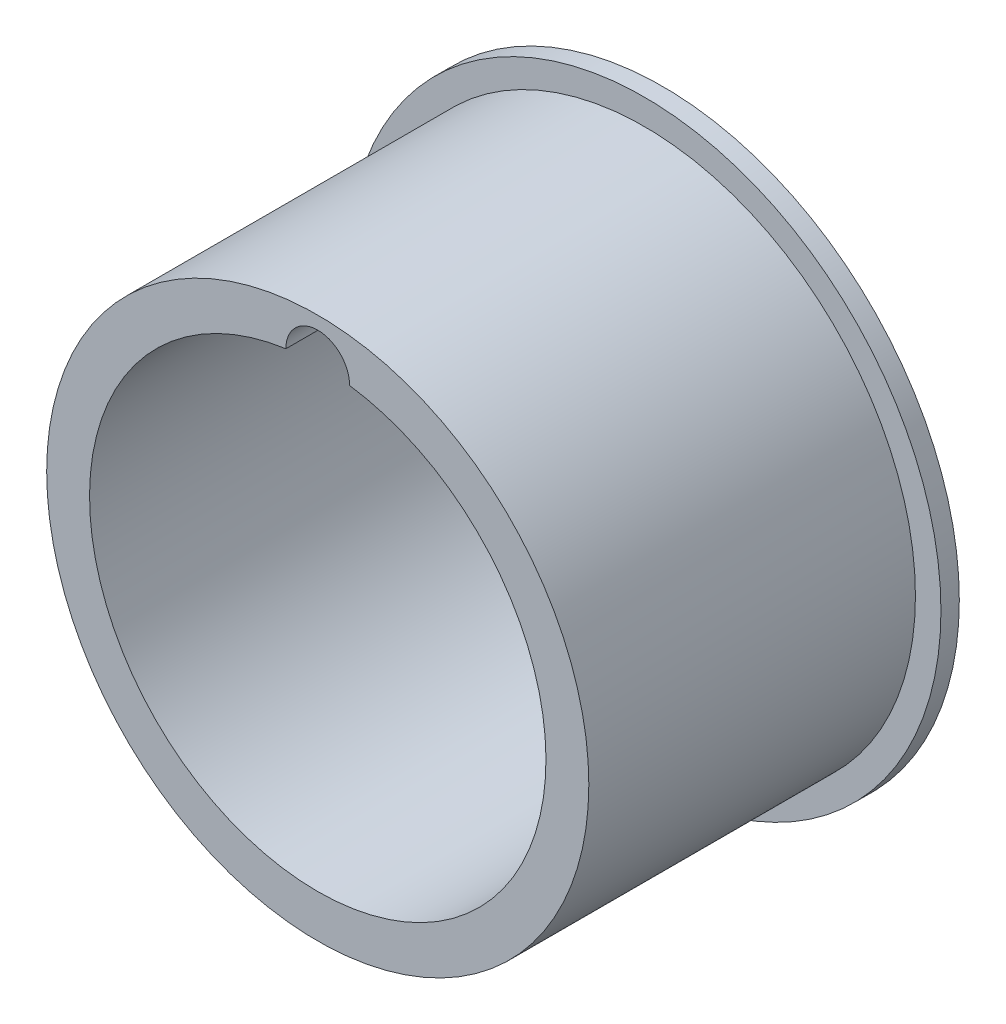
ISO-10303-21;
HEADER;
FILE_DESCRIPTION(('STEP AP214'),'2;1');
FILE_NAME('part.step','',(''),(''),'','','');
FILE_SCHEMA(('AUTOMOTIVE_DESIGN { 1 0 10303 214 1 1 1 1 }'));
ENDSEC;
DATA;
#1=APPLICATION_CONTEXT('core data for automotive mechanical design processes');
#2=APPLICATION_PROTOCOL_DEFINITION('international standard','automotive_design',2000,#1);
#3=PRODUCT_CONTEXT('',#1,'mechanical');
#4=PRODUCT('Part','Part','',(#3));
#5=PRODUCT_RELATED_PRODUCT_CATEGORY('part','',(#4));
#6=PRODUCT_DEFINITION_FORMATION('','',#4);
#7=PRODUCT_DEFINITION_CONTEXT('part definition',#1,'design');
#8=PRODUCT_DEFINITION('design','',#6,#7);
#9=PRODUCT_DEFINITION_SHAPE('','',#8);
#10=(LENGTH_UNIT() NAMED_UNIT(*) SI_UNIT(.MILLI.,.METRE.));
#11=(NAMED_UNIT(*) PLANE_ANGLE_UNIT() SI_UNIT($,.RADIAN.));
#12=(NAMED_UNIT(*) SI_UNIT($,.STERADIAN.) SOLID_ANGLE_UNIT());
#13=UNCERTAINTY_MEASURE_WITH_UNIT(LENGTH_MEASURE(1.E-05),#10,'distance_accuracy_value','');
#14=(GEOMETRIC_REPRESENTATION_CONTEXT(3) GLOBAL_UNCERTAINTY_ASSIGNED_CONTEXT((#13)) GLOBAL_UNIT_ASSIGNED_CONTEXT((#10,
#11,#12)) REPRESENTATION_CONTEXT('',''));
#15=CARTESIAN_POINT('',(0.,0.,0.));
#16=DIRECTION('',(0.,0.,1.));
#17=DIRECTION('',(1.,0.,0.));
#18=AXIS2_PLACEMENT_3D('',#15,#16,#17);
#19=CARTESIAN_POINT('',(0.,0.,0.));
#20=DIRECTION('',(0.,0.,1.));
#21=DIRECTION('',(1.,0.,0.));
#22=AXIS2_PLACEMENT_3D('',#19,#20,#21);
#23=PLANE('',#22);
#24=CARTESIAN_POINT('',(0.,28.1444585537394,0.));
#25=DIRECTION('',(0.,0.,1.));
#26=DIRECTION('',(1.,0.,0.));
#27=AXIS2_PLACEMENT_3D('',#24,#25,#26);
#28=CIRCLE('',#27,3.96252340873946);
#29=CARTESIAN_POINT('',(-3.96244410089683,28.1193884106192,0.));
#30=VERTEX_POINT('',#29);
#31=CARTESIAN_POINT('',(-3.95269283666769,27.8655121363687,0.));
#32=VERTEX_POINT('',#31);
#33=EDGE_CURVE('E130',#30,#32,#28,.T.);
#34=ORIENTED_EDGE('',*,*,#33,.F.);
#35=CARTESIAN_POINT('',(0.,0.,0.));
#36=DIRECTION('',(0.,0.,1.));
#37=DIRECTION('',(1.,0.,0.));
#38=AXIS2_PLACEMENT_3D('',#35,#36,#37);
#39=CIRCLE('',#38,28.3972);
#40=CARTESIAN_POINT('',(3.96244410089684,28.1193884106192,0.));
#41=VERTEX_POINT('',#40);
#42=EDGE_CURVE('E88',#41,#30,#39,.F.);
#43=ORIENTED_EDGE('',*,*,#42,.F.);
#44=CARTESIAN_POINT('',(3.95269283666769,27.8655121363687,0.));
#45=VERTEX_POINT('',#44);
#46=EDGE_CURVE('E90',#45,#41,#28,.T.);
#47=ORIENTED_EDGE('',*,*,#46,.F.);
#48=CARTESIAN_POINT('',(0.,0.,0.));
#49=DIRECTION('',(0.,0.,1.));
#50=DIRECTION('',(1.,0.,0.));
#51=AXIS2_PLACEMENT_3D('',#48,#49,#50);
#52=CIRCLE('',#51,28.1444585537394);
#53=EDGE_CURVE('E114',#32,#45,#52,.T.);
#54=ORIENTED_EDGE('',*,*,#53,.F.);
#55=EDGE_LOOP('',(#34,#43,#47,#54));
#56=FACE_BOUND('',#55,.T.);
#57=ADVANCED_FACE('F39',(#56),#23,.T.);
#58=CARTESIAN_POINT('',(0.,0.,-2.286));
#59=DIRECTION('',(0.,0.,1.));
#60=DIRECTION('',(1.,0.,0.));
#61=AXIS2_PLACEMENT_3D('',#58,#59,#60);
#62=CYLINDRICAL_SURFACE('',#61,36.9062);
#63=CARTESIAN_POINT('',(0.,0.,-2.286));
#64=DIRECTION('',(0.,0.,1.));
#65=DIRECTION('',(1.,0.,0.));
#66=AXIS2_PLACEMENT_3D('',#63,#64,#65);
#67=CIRCLE('',#66,36.9062);
#68=CARTESIAN_POINT('',(36.9062,0.,-2.286));
#69=VERTEX_POINT('',#68);
#70=EDGE_CURVE('E101',#69,#69,#67,.T.);
#71=ORIENTED_EDGE('',*,*,#70,.T.);
#72=EDGE_LOOP('',(#71));
#73=FACE_BOUND('',#72,.T.);
#74=CARTESIAN_POINT('',(0.,0.,0.));
#75=DIRECTION('',(0.,0.,1.));
#76=DIRECTION('',(1.,0.,0.));
#77=AXIS2_PLACEMENT_3D('',#74,#75,#76);
#78=CIRCLE('',#77,36.9062);
#79=CARTESIAN_POINT('',(36.9062,0.,0.));
#80=VERTEX_POINT('',#79);
#81=EDGE_CURVE('E106',#80,#80,#78,.T.);
#82=ORIENTED_EDGE('',*,*,#81,.F.);
#83=EDGE_LOOP('',(#82));
#84=FACE_BOUND('',#83,.T.);
#85=ADVANCED_FACE('F146',(#73,#84),#62,.T.);
#86=CARTESIAN_POINT('',(0.,0.,-2.286));
#87=DIRECTION('',(0.,0.,1.));
#88=DIRECTION('',(1.,0.,0.));
#89=AXIS2_PLACEMENT_3D('',#86,#87,#88);
#90=PLANE('',#89);
#91=CARTESIAN_POINT('',(0.,0.,-2.286));
#92=DIRECTION('',(0.,0.,1.));
#93=DIRECTION('',(1.,0.,0.));
#94=AXIS2_PLACEMENT_3D('',#91,#92,#93);
#95=CIRCLE('',#94,28.1444585537394);
#96=CARTESIAN_POINT('',(-3.95269283666771,27.8655121363687,-2.286));
#97=VERTEX_POINT('',#96);
#98=CARTESIAN_POINT('',(3.95269283666771,27.8655121363687,-2.286));
#99=VERTEX_POINT('',#98);
#100=EDGE_CURVE('E110',#97,#99,#95,.T.);
#101=ORIENTED_EDGE('',*,*,#100,.T.);
#102=CARTESIAN_POINT('',(0.,28.1444585537394,-2.286));
#103=DIRECTION('',(0.,0.,1.));
#104=DIRECTION('',(1.,0.,0.));
#105=AXIS2_PLACEMENT_3D('',#102,#103,#104);
#106=CIRCLE('',#105,3.96252340873946);
#107=EDGE_CURVE('E118',#99,#97,#106,.T.);
#108=ORIENTED_EDGE('',*,*,#107,.T.);
#109=EDGE_LOOP('',(#101,#108));
#110=FACE_BOUND('',#109,.T.);
#111=ORIENTED_EDGE('',*,*,#70,.F.);
#112=EDGE_LOOP('',(#111));
#113=FACE_BOUND('',#112,.T.);
#114=ADVANCED_FACE('F142',(#110,#113),#90,.F.);
#115=CARTESIAN_POINT('',(0.,0.,0.));
#116=DIRECTION('',(0.,0.,1.));
#117=DIRECTION('',(1.,0.,0.));
#118=AXIS2_PLACEMENT_3D('',#115,#116,#117);
#119=CIRCLE('',#118,33.7312);
#120=CARTESIAN_POINT('',(33.7312,0.,0.));
#121=VERTEX_POINT('',#120);
#122=EDGE_CURVE('E48',#121,#121,#119,.F.);
#123=ORIENTED_EDGE('',*,*,#122,.T.);
#124=EDGE_LOOP('',(#123));
#125=FACE_BOUND('',#124,.T.);
#126=ORIENTED_EDGE('',*,*,#81,.T.);
#127=EDGE_LOOP('',(#126));
#128=FACE_BOUND('',#127,.T.);
#129=ADVANCED_FACE('F145',(#125,#128),#23,.T.);
#130=CARTESIAN_POINT('',(0.,0.,-2.286));
#131=DIRECTION('',(0.,0.,1.));
#132=DIRECTION('',(1.,0.,0.));
#133=AXIS2_PLACEMENT_3D('',#130,#131,#132);
#134=CYLINDRICAL_SURFACE('',#133,28.1444585537394);
#135=ORIENTED_EDGE('',*,*,#100,.F.);
#136=DIRECTION('',(0.,0.,1.));
#137=VECTOR('',#136,1.);
#138=CARTESIAN_POINT('',(-3.95269283666771,27.8655121363687,33.401));
#139=LINE('',#138,#137);
#140=EDGE_CURVE('E61',#97,#32,#139,.T.);
#141=ORIENTED_EDGE('',*,*,#140,.T.);
#142=ORIENTED_EDGE('',*,*,#53,.T.);
#143=DIRECTION('',(0.,0.,1.));
#144=VECTOR('',#143,1.);
#145=CARTESIAN_POINT('',(3.95269283666771,27.8655121363687,33.401));
#146=LINE('',#145,#144);
#147=EDGE_CURVE('E126',#45,#99,#146,.F.);
#148=ORIENTED_EDGE('',*,*,#147,.T.);
#149=EDGE_LOOP('',(#135,#141,#142,#148));
#150=FACE_BOUND('',#149,.T.);
#151=ADVANCED_FACE('F140',(#150),#134,.F.);
#152=CARTESIAN_POINT('',(0.,0.,-0.253999999999999));
#153=DIRECTION('',(0.,0.,1.));
#154=DIRECTION('',(1.,0.,0.));
#155=AXIS2_PLACEMENT_3D('',#152,#153,#154);
#156=CYLINDRICAL_SURFACE('',#155,33.7312);
#157=ORIENTED_EDGE('',*,*,#122,.F.);
#158=EDGE_LOOP('',(#157));
#159=FACE_BOUND('',#158,.T.);
#160=CARTESIAN_POINT('',(0.,0.,40.64));
#161=DIRECTION('',(0.,0.,1.));
#162=DIRECTION('',(1.,0.,0.));
#163=AXIS2_PLACEMENT_3D('',#160,#161,#162);
#164=CIRCLE('',#163,33.7312);
#165=CARTESIAN_POINT('',(33.7312,0.,40.64));
#166=VERTEX_POINT('',#165);
#167=EDGE_CURVE('E95',#166,#166,#164,.T.);
#168=ORIENTED_EDGE('',*,*,#167,.F.);
#169=EDGE_LOOP('',(#168));
#170=FACE_BOUND('',#169,.T.);
#171=ADVANCED_FACE('F41',(#159,#170),#156,.T.);
#172=CARTESIAN_POINT('',(0.,0.,-0.253999999999999));
#173=DIRECTION('',(0.,0.,1.));
#174=DIRECTION('',(1.,0.,0.));
#175=AXIS2_PLACEMENT_3D('',#172,#173,#174);
#176=CYLINDRICAL_SURFACE('',#175,28.3972);
#177=ORIENTED_EDGE('',*,*,#42,.T.);
#178=DIRECTION('',(0.,0.,1.));
#179=VECTOR('',#178,1.);
#180=CARTESIAN_POINT('',(-3.96244410089684,28.1193884106192,33.401));
#181=LINE('',#180,#179);
#182=CARTESIAN_POINT('',(-3.96244410089684,28.1193884106192,40.64));
#183=VERTEX_POINT('',#182);
#184=EDGE_CURVE('E78',#30,#183,#181,.T.);
#185=ORIENTED_EDGE('',*,*,#184,.T.);
#186=CARTESIAN_POINT('',(0.,0.,40.64));
#187=DIRECTION('',(0.,0.,1.));
#188=DIRECTION('',(1.,0.,0.));
#189=AXIS2_PLACEMENT_3D('',#186,#187,#188);
#190=CIRCLE('',#189,28.3972);
#191=CARTESIAN_POINT('',(3.96244410089684,28.1193884106192,40.64));
#192=VERTEX_POINT('',#191);
#193=EDGE_CURVE('E86',#183,#192,#190,.T.);
#194=ORIENTED_EDGE('',*,*,#193,.T.);
#195=DIRECTION('',(0.,0.,1.));
#196=VECTOR('',#195,1.);
#197=CARTESIAN_POINT('',(3.96244410089684,28.1193884106192,33.401));
#198=LINE('',#197,#196);
#199=EDGE_CURVE('E54',#192,#41,#198,.F.);
#200=ORIENTED_EDGE('',*,*,#199,.T.);
#201=EDGE_LOOP('',(#177,#185,#194,#200));
#202=FACE_BOUND('',#201,.T.);
#203=ADVANCED_FACE('F85',(#202),#176,.F.);
#204=CARTESIAN_POINT('',(0.,0.,40.64));
#205=DIRECTION('',(0.,0.,1.));
#206=DIRECTION('',(1.,0.,0.));
#207=AXIS2_PLACEMENT_3D('',#204,#205,#206);
#208=PLANE('',#207);
#209=CARTESIAN_POINT('',(0.,28.1444585537394,40.64));
#210=DIRECTION('',(0.,0.,1.));
#211=DIRECTION('',(1.,0.,0.));
#212=AXIS2_PLACEMENT_3D('',#209,#210,#211);
#213=CIRCLE('',#212,3.96252340873946);
#214=EDGE_CURVE('E11',#192,#183,#213,.T.);
#215=ORIENTED_EDGE('',*,*,#214,.F.);
#216=ORIENTED_EDGE('',*,*,#193,.F.);
#217=EDGE_LOOP('',(#215,#216));
#218=FACE_BOUND('',#217,.T.);
#219=ORIENTED_EDGE('',*,*,#167,.T.);
#220=EDGE_LOOP('',(#219));
#221=FACE_BOUND('',#220,.T.);
#222=ADVANCED_FACE('F92',(#218,#221),#208,.T.);
#223=CARTESIAN_POINT('',(0.,28.1444585537394,-4.064));
#224=DIRECTION('',(0.,0.,1.));
#225=DIRECTION('',(1.,0.,0.));
#226=AXIS2_PLACEMENT_3D('',#223,#224,#225);
#227=CYLINDRICAL_SURFACE('',#226,3.96252340873946);
#228=ORIENTED_EDGE('',*,*,#147,.F.);
#229=ORIENTED_EDGE('',*,*,#46,.T.);
#230=ORIENTED_EDGE('',*,*,#199,.F.);
#231=ORIENTED_EDGE('',*,*,#214,.T.);
#232=ORIENTED_EDGE('',*,*,#184,.F.);
#233=ORIENTED_EDGE('',*,*,#33,.T.);
#234=ORIENTED_EDGE('',*,*,#140,.F.);
#235=ORIENTED_EDGE('',*,*,#107,.F.);
#236=EDGE_LOOP('',(#228,#229,#230,#231,#232,#233,#234,#235));
#237=FACE_BOUND('',#236,.T.);
#238=ADVANCED_FACE('F77',(#237),#227,.F.);
#239=CLOSED_SHELL('',(#57,#85,#114,#129,#151,#171,#203,#222,#238));
#240=MANIFOLD_SOLID_BREP('B2',#239);
#241=ADVANCED_BREP_SHAPE_REPRESENTATION('',(#18,#240),#14);
#242=SHAPE_DEFINITION_REPRESENTATION(#9,#241);
ENDSEC;
END-ISO-10303-21;
